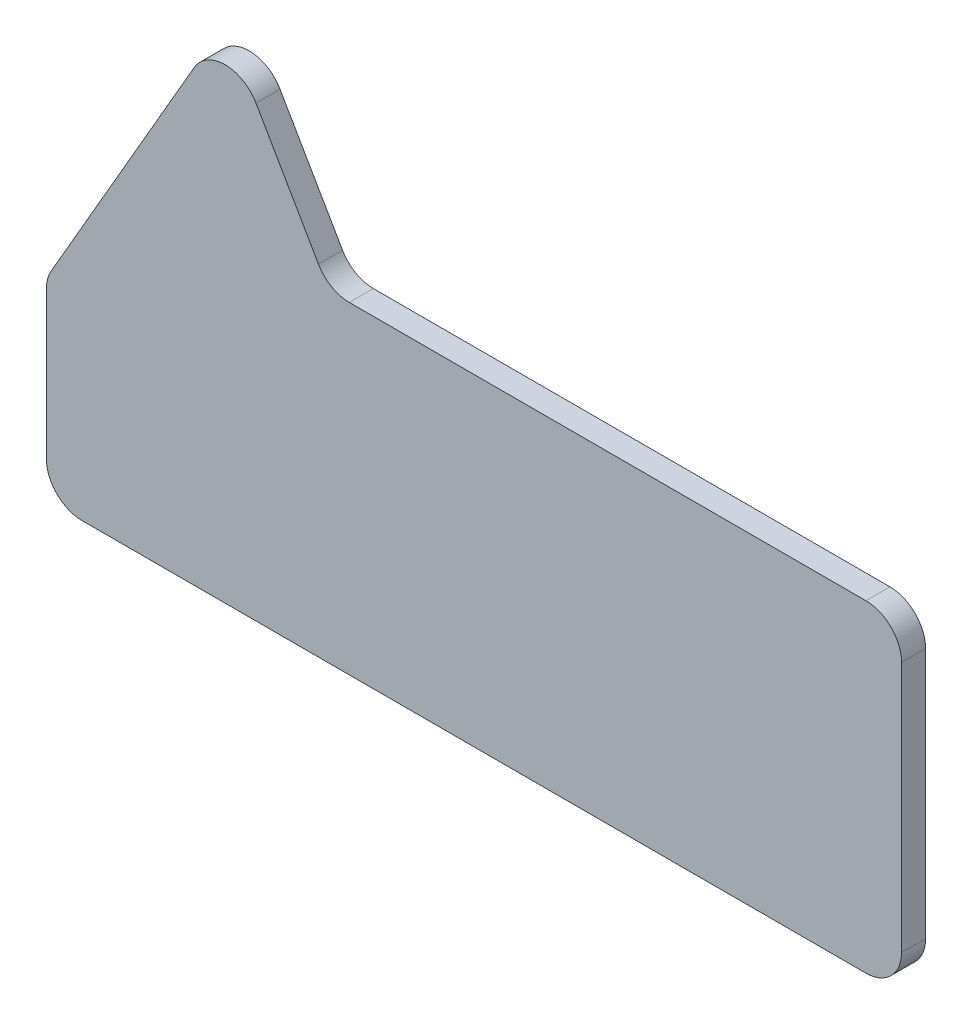
ISO-10303-21;
HEADER;
FILE_DESCRIPTION(('STEP AP214'),'2;1');
FILE_NAME('part.step','',(''),(''),'','','');
FILE_SCHEMA(('AUTOMOTIVE_DESIGN { 1 0 10303 214 1 1 1 1 }'));
ENDSEC;
DATA;
#1=APPLICATION_CONTEXT('core data for automotive mechanical design processes');
#2=APPLICATION_PROTOCOL_DEFINITION('international standard','automotive_design',2000,#1);
#3=PRODUCT_CONTEXT('',#1,'mechanical');
#4=PRODUCT('Part','Part','',(#3));
#5=PRODUCT_RELATED_PRODUCT_CATEGORY('part','',(#4));
#6=PRODUCT_DEFINITION_FORMATION('','',#4);
#7=PRODUCT_DEFINITION_CONTEXT('part definition',#1,'design');
#8=PRODUCT_DEFINITION('design','',#6,#7);
#9=PRODUCT_DEFINITION_SHAPE('','',#8);
#10=(LENGTH_UNIT() NAMED_UNIT(*) SI_UNIT(.MILLI.,.METRE.));
#11=(NAMED_UNIT(*) PLANE_ANGLE_UNIT() SI_UNIT($,.RADIAN.));
#12=(NAMED_UNIT(*) SI_UNIT($,.STERADIAN.) SOLID_ANGLE_UNIT());
#13=UNCERTAINTY_MEASURE_WITH_UNIT(LENGTH_MEASURE(1.E-05),#10,'distance_accuracy_value','');
#14=(GEOMETRIC_REPRESENTATION_CONTEXT(3) GLOBAL_UNCERTAINTY_ASSIGNED_CONTEXT((#13)) GLOBAL_UNIT_ASSIGNED_CONTEXT((#10,
#11,#12)) REPRESENTATION_CONTEXT('',''));
#15=CARTESIAN_POINT('',(0.,0.,0.));
#16=DIRECTION('',(0.,0.,1.));
#17=DIRECTION('',(1.,0.,0.));
#18=AXIS2_PLACEMENT_3D('',#15,#16,#17);
#19=CARTESIAN_POINT('',(23.4386772303298,-8.59629034495361,1.35));
#20=DIRECTION('',(0.,0.,-1.));
#21=DIRECTION('',(-1.,0.,0.));
#22=AXIS2_PLACEMENT_3D('',#19,#20,#21);
#23=CYLINDRICAL_SURFACE('',#22,2.);
#24=CARTESIAN_POINT('',(23.4386772303298,-8.59629034495361,0.));
#25=DIRECTION('',(0.,0.,1.));
#26=DIRECTION('',(1.,0.,0.));
#27=AXIS2_PLACEMENT_3D('',#24,#25,#26);
#28=CIRCLE('',#27,2.);
#29=CARTESIAN_POINT('',(23.4386772303298,-10.5962903449536,0.));
#30=VERTEX_POINT('',#29);
#31=CARTESIAN_POINT('',(25.4386772303298,-8.5962903449536,0.));
#32=VERTEX_POINT('',#31);
#33=EDGE_CURVE('E153',#30,#32,#28,.T.);
#34=ORIENTED_EDGE('',*,*,#33,.T.);
#35=DIRECTION('',(0.,0.,-1.));
#36=VECTOR('',#35,1.);
#37=CARTESIAN_POINT('',(25.4386772303298,-8.5962903449536,1.35));
#38=LINE('',#37,#36);
#39=CARTESIAN_POINT('',(25.4386772303298,-8.5962903449536,1.35));
#40=VERTEX_POINT('',#39);
#41=EDGE_CURVE('E11',#40,#32,#38,.T.);
#42=ORIENTED_EDGE('',*,*,#41,.F.);
#43=CARTESIAN_POINT('',(23.4386772303298,-8.59629034495361,1.35));
#44=DIRECTION('',(0.,0.,1.));
#45=DIRECTION('',(1.,0.,0.));
#46=AXIS2_PLACEMENT_3D('',#43,#44,#45);
#47=CIRCLE('',#46,2.);
#48=CARTESIAN_POINT('',(23.4386772303298,-10.5962903449536,1.35));
#49=VERTEX_POINT('',#48);
#50=EDGE_CURVE('E175',#49,#40,#47,.T.);
#51=ORIENTED_EDGE('',*,*,#50,.F.);
#52=DIRECTION('',(0.,0.,-1.));
#53=VECTOR('',#52,1.);
#54=CARTESIAN_POINT('',(23.4386772303298,-10.5962903449536,1.35));
#55=LINE('',#54,#53);
#56=EDGE_CURVE('E149',#49,#30,#55,.T.);
#57=ORIENTED_EDGE('',*,*,#56,.T.);
#58=EDGE_LOOP('',(#34,#42,#51,#57));
#59=FACE_BOUND('',#58,.T.);
#60=ADVANCED_FACE('F33',(#59),#23,.T.);
#61=CARTESIAN_POINT('',(25.4386772303298,5.50370965504639,1.35));
#62=DIRECTION('',(-1.,0.,0.));
#63=DIRECTION('',(0.,-1.,0.));
#64=AXIS2_PLACEMENT_3D('',#61,#62,#63);
#65=PLANE('',#64);
#66=DIRECTION('',(0.,1.,0.));
#67=VECTOR('',#66,1.);
#68=CARTESIAN_POINT('',(25.4386772303298,5.50370965504639,0.));
#69=LINE('',#68,#67);
#70=CARTESIAN_POINT('',(25.4386772303298,5.50370965504639,0.));
#71=VERTEX_POINT('',#70);
#72=EDGE_CURVE('E156',#32,#71,#69,.T.);
#73=ORIENTED_EDGE('',*,*,#72,.T.);
#74=DIRECTION('',(0.,0.,-1.));
#75=VECTOR('',#74,1.);
#76=CARTESIAN_POINT('',(25.4386772303298,5.50370965504639,1.35));
#77=LINE('',#76,#75);
#78=CARTESIAN_POINT('',(25.4386772303298,5.50370965504639,1.35));
#79=VERTEX_POINT('',#78);
#80=EDGE_CURVE('E41',#79,#71,#77,.T.);
#81=ORIENTED_EDGE('',*,*,#80,.F.);
#82=DIRECTION('',(0.,1.,0.));
#83=VECTOR('',#82,1.);
#84=CARTESIAN_POINT('',(25.4386772303298,5.50370965504639,1.35));
#85=LINE('',#84,#83);
#86=EDGE_CURVE('E104',#40,#79,#85,.T.);
#87=ORIENTED_EDGE('',*,*,#86,.F.);
#88=ORIENTED_EDGE('',*,*,#41,.T.);
#89=EDGE_LOOP('',(#73,#81,#87,#88));
#90=FACE_BOUND('',#89,.T.);
#91=ADVANCED_FACE('F253',(#90),#65,.F.);
#92=CARTESIAN_POINT('',(23.4386772303298,5.50370965504639,1.35));
#93=DIRECTION('',(0.,0.,-1.));
#94=DIRECTION('',(-1.,0.,0.));
#95=AXIS2_PLACEMENT_3D('',#92,#93,#94);
#96=CYLINDRICAL_SURFACE('',#95,2.);
#97=CARTESIAN_POINT('',(23.4386772303298,5.50370965504639,0.));
#98=DIRECTION('',(0.,0.,1.));
#99=DIRECTION('',(1.,0.,0.));
#100=AXIS2_PLACEMENT_3D('',#97,#98,#99);
#101=CIRCLE('',#100,2.);
#102=CARTESIAN_POINT('',(23.4386772303298,7.50370965504639,0.));
#103=VERTEX_POINT('',#102);
#104=EDGE_CURVE('E158',#71,#103,#101,.T.);
#105=ORIENTED_EDGE('',*,*,#104,.T.);
#106=DIRECTION('',(0.,0.,-1.));
#107=VECTOR('',#106,1.);
#108=CARTESIAN_POINT('',(23.4386772303298,7.50370965504639,1.35));
#109=LINE('',#108,#107);
#110=CARTESIAN_POINT('',(23.4386772303298,7.50370965504639,1.35));
#111=VERTEX_POINT('',#110);
#112=EDGE_CURVE('E194',#111,#103,#109,.T.);
#113=ORIENTED_EDGE('',*,*,#112,.F.);
#114=CARTESIAN_POINT('',(23.4386772303298,5.50370965504639,1.35));
#115=DIRECTION('',(0.,0.,1.));
#116=DIRECTION('',(1.,0.,0.));
#117=AXIS2_PLACEMENT_3D('',#114,#115,#116);
#118=CIRCLE('',#117,2.);
#119=EDGE_CURVE('E202',#79,#111,#118,.T.);
#120=ORIENTED_EDGE('',*,*,#119,.F.);
#121=ORIENTED_EDGE('',*,*,#80,.T.);
#122=EDGE_LOOP('',(#105,#113,#120,#121));
#123=FACE_BOUND('',#122,.T.);
#124=ADVANCED_FACE('F200',(#123),#96,.T.);
#125=CARTESIAN_POINT('',(23.4386772303298,7.50370965504639,1.35));
#126=DIRECTION('',(0.,-1.,0.));
#127=DIRECTION('',(1.,0.,0.));
#128=AXIS2_PLACEMENT_3D('',#125,#126,#127);
#129=PLANE('',#128);
#130=DIRECTION('',(-1.,0.,0.));
#131=VECTOR('',#130,1.);
#132=CARTESIAN_POINT('',(23.4386772303298,7.50370965504639,0.));
#133=LINE('',#132,#131);
#134=CARTESIAN_POINT('',(-5.55175383132779,7.50370965504646,0.));
#135=VERTEX_POINT('',#134);
#136=EDGE_CURVE('E160',#103,#135,#133,.T.);
#137=ORIENTED_EDGE('',*,*,#136,.T.);
#138=DIRECTION('',(0.,0.,-1.));
#139=VECTOR('',#138,1.);
#140=CARTESIAN_POINT('',(-5.55175383132779,7.50370965504646,1.35));
#141=LINE('',#140,#139);
#142=CARTESIAN_POINT('',(-5.55175383132779,7.50370965504646,1.35));
#143=VERTEX_POINT('',#142);
#144=EDGE_CURVE('E191',#143,#135,#141,.T.);
#145=ORIENTED_EDGE('',*,*,#144,.F.);
#146=DIRECTION('',(-1.,0.,0.));
#147=VECTOR('',#146,1.);
#148=CARTESIAN_POINT('',(23.4386772303298,7.50370965504639,1.35));
#149=LINE('',#148,#147);
#150=EDGE_CURVE('E220',#111,#143,#149,.T.);
#151=ORIENTED_EDGE('',*,*,#150,.F.);
#152=ORIENTED_EDGE('',*,*,#112,.T.);
#153=EDGE_LOOP('',(#137,#145,#151,#152));
#154=FACE_BOUND('',#153,.T.);
#155=ADVANCED_FACE('F211',(#154),#129,.F.);
#156=CARTESIAN_POINT('',(-5.55175383132775,9.50370965504634,1.35));
#157=DIRECTION('',(0.,0.,-1.));
#158=DIRECTION('',(-1.,0.,0.));
#159=AXIS2_PLACEMENT_3D('',#156,#157,#158);
#160=CYLINDRICAL_SURFACE('',#159,1.99999999999988);
#161=CARTESIAN_POINT('',(-5.55175383132775,9.50370965504634,0.));
#162=DIRECTION('',(0.,0.,-1.));
#163=DIRECTION('',(1.,0.,0.));
#164=AXIS2_PLACEMENT_3D('',#161,#162,#163);
#165=CIRCLE('',#164,1.99999999999988);
#166=CARTESIAN_POINT('',(-7.2838046388967,8.50370965504656,0.));
#167=VERTEX_POINT('',#166);
#168=EDGE_CURVE('E162',#135,#167,#165,.T.);
#169=ORIENTED_EDGE('',*,*,#168,.T.);
#170=DIRECTION('',(0.,0.,-1.));
#171=VECTOR('',#170,1.);
#172=CARTESIAN_POINT('',(-7.2838046388967,8.50370965504656,1.35));
#173=LINE('',#172,#171);
#174=CARTESIAN_POINT('',(-7.2838046388967,8.50370965504656,1.35));
#175=VERTEX_POINT('',#174);
#176=EDGE_CURVE('E188',#175,#167,#173,.T.);
#177=ORIENTED_EDGE('',*,*,#176,.F.);
#178=CARTESIAN_POINT('',(-5.55175383132775,9.50370965504634,1.35));
#179=DIRECTION('',(0.,0.,-1.));
#180=DIRECTION('',(1.,0.,0.));
#181=AXIS2_PLACEMENT_3D('',#178,#179,#180);
#182=CIRCLE('',#181,1.99999999999988);
#183=EDGE_CURVE('E217',#143,#175,#182,.T.);
#184=ORIENTED_EDGE('',*,*,#183,.F.);
#185=ORIENTED_EDGE('',*,*,#144,.T.);
#186=EDGE_LOOP('',(#169,#177,#184,#185));
#187=FACE_BOUND('',#186,.T.);
#188=ADVANCED_FACE('F215',(#187),#160,.F.);
#189=CARTESIAN_POINT('',(-7.2838046388967,8.50370965504656,1.35));
#190=DIRECTION('',(-0.866025403784422,-0.500000000000029,0.));
#191=DIRECTION('',(0.500000000000029,-0.866025403784422,0.));
#192=AXIS2_PLACEMENT_3D('',#189,#190,#191);
#193=PLANE('',#192);
#194=DIRECTION('',(-0.500000000000029,0.866025403784422,0.));
#195=VECTOR('',#194,1.);
#196=CARTESIAN_POINT('',(-7.2838046388967,8.50370965504656,0.));
#197=LINE('',#196,#195);
#198=CARTESIAN_POINT('',(-10.7879750940267,14.573110921713,0.));
#199=VERTEX_POINT('',#198);
#200=EDGE_CURVE('E164',#167,#199,#197,.T.);
#201=ORIENTED_EDGE('',*,*,#200,.T.);
#202=DIRECTION('',(0.,0.,-1.));
#203=VECTOR('',#202,1.);
#204=CARTESIAN_POINT('',(-10.7879750940267,14.573110921713,1.35));
#205=LINE('',#204,#203);
#206=CARTESIAN_POINT('',(-10.7879750940267,14.573110921713,1.35));
#207=VERTEX_POINT('',#206);
#208=EDGE_CURVE('E185',#207,#199,#205,.T.);
#209=ORIENTED_EDGE('',*,*,#208,.F.);
#210=DIRECTION('',(-0.500000000000029,0.866025403784422,0.));
#211=VECTOR('',#210,1.);
#212=CARTESIAN_POINT('',(-7.2838046388967,8.50370965504656,1.35));
#213=LINE('',#212,#211);
#214=EDGE_CURVE('E219',#175,#207,#213,.T.);
#215=ORIENTED_EDGE('',*,*,#214,.F.);
#216=ORIENTED_EDGE('',*,*,#176,.T.);
#217=EDGE_LOOP('',(#201,#209,#215,#216));
#218=FACE_BOUND('',#217,.T.);
#219=ADVANCED_FACE('F266',(#218),#193,.F.);
#220=CARTESIAN_POINT('',(-12.5200259015956,13.573110921713,1.35));
#221=DIRECTION('',(0.,0.,-1.));
#222=DIRECTION('',(-1.,0.,0.));
#223=AXIS2_PLACEMENT_3D('',#220,#221,#222);
#224=CYLINDRICAL_SURFACE('',#223,2.);
#225=CARTESIAN_POINT('',(-12.5200259015956,13.573110921713,0.));
#226=DIRECTION('',(0.,0.,1.));
#227=DIRECTION('',(-1.,0.,0.));
#228=AXIS2_PLACEMENT_3D('',#225,#226,#227);
#229=CIRCLE('',#228,2.);
#230=CARTESIAN_POINT('',(-14.2520767091645,14.573110921713,0.));
#231=VERTEX_POINT('',#230);
#232=EDGE_CURVE('E166',#199,#231,#229,.T.);
#233=ORIENTED_EDGE('',*,*,#232,.T.);
#234=DIRECTION('',(0.,0.,-1.));
#235=VECTOR('',#234,1.);
#236=CARTESIAN_POINT('',(-14.2520767091645,14.573110921713,1.35));
#237=LINE('',#236,#235);
#238=CARTESIAN_POINT('',(-14.2520767091645,14.573110921713,1.35));
#239=VERTEX_POINT('',#238);
#240=EDGE_CURVE('E182',#239,#231,#237,.T.);
#241=ORIENTED_EDGE('',*,*,#240,.F.);
#242=CARTESIAN_POINT('',(-12.5200259015956,13.573110921713,1.35));
#243=DIRECTION('',(0.,0.,1.));
#244=DIRECTION('',(-1.,0.,0.));
#245=AXIS2_PLACEMENT_3D('',#242,#243,#244);
#246=CIRCLE('',#245,2.);
#247=EDGE_CURVE('E222',#207,#239,#246,.T.);
#248=ORIENTED_EDGE('',*,*,#247,.F.);
#249=ORIENTED_EDGE('',*,*,#208,.T.);
#250=EDGE_LOOP('',(#233,#241,#248,#249));
#251=FACE_BOUND('',#250,.T.);
#252=ADVANCED_FACE('F269',(#251),#224,.T.);
#253=CARTESIAN_POINT('',(-14.2520767091645,14.573110921713,1.35));
#254=DIRECTION('',(0.866025403784441,-0.499999999999995,0.));
#255=DIRECTION('',(0.499999999999995,0.866025403784442,0.));
#256=AXIS2_PLACEMENT_3D('',#253,#254,#255);
#257=PLANE('',#256);
#258=DIRECTION('',(-0.499999999999995,-0.866025403784441,0.));
#259=VECTOR('',#258,1.);
#260=CARTESIAN_POINT('',(-14.2520767091645,14.573110921713,0.));
#261=LINE('',#260,#259);
#262=CARTESIAN_POINT('',(-22.2822037280863,0.664522933708779,0.));
#263=VERTEX_POINT('',#262);
#264=EDGE_CURVE('E168',#231,#263,#261,.T.);
#265=ORIENTED_EDGE('',*,*,#264,.T.);
#266=DIRECTION('',(0.,0.,-1.));
#267=VECTOR('',#266,1.);
#268=CARTESIAN_POINT('',(-22.2822037280863,0.664522933708779,1.35));
#269=LINE('',#268,#267);
#270=CARTESIAN_POINT('',(-22.2822037280863,0.664522933708779,1.35));
#271=VERTEX_POINT('',#270);
#272=EDGE_CURVE('E179',#271,#263,#269,.T.);
#273=ORIENTED_EDGE('',*,*,#272,.F.);
#274=DIRECTION('',(-0.499999999999995,-0.866025403784441,0.));
#275=VECTOR('',#274,1.);
#276=CARTESIAN_POINT('',(-14.2520767091645,14.573110921713,1.35));
#277=LINE('',#276,#275);
#278=EDGE_CURVE('E228',#239,#271,#277,.T.);
#279=ORIENTED_EDGE('',*,*,#278,.F.);
#280=ORIENTED_EDGE('',*,*,#240,.T.);
#281=EDGE_LOOP('',(#265,#273,#279,#280));
#282=FACE_BOUND('',#281,.T.);
#283=ADVANCED_FACE('F234',(#282),#257,.F.);
#284=CARTESIAN_POINT('',(-20.5501529205184,-0.335477066290429,1.35));
#285=DIRECTION('',(0.,0.,-1.));
#286=DIRECTION('',(-1.,0.,0.));
#287=AXIS2_PLACEMENT_3D('',#284,#285,#286);
#288=CYLINDRICAL_SURFACE('',#287,1.99999999999877);
#289=CARTESIAN_POINT('',(-20.5501529205184,-0.335477066290429,0.));
#290=DIRECTION('',(0.,0.,1.));
#291=DIRECTION('',(1.,0.,0.));
#292=AXIS2_PLACEMENT_3D('',#289,#290,#291);
#293=CIRCLE('',#292,1.99999999999877);
#294=CARTESIAN_POINT('',(-22.5501529205172,-0.335477066290765,0.));
#295=VERTEX_POINT('',#294);
#296=EDGE_CURVE('E170',#263,#295,#293,.T.);
#297=ORIENTED_EDGE('',*,*,#296,.T.);
#298=DIRECTION('',(0.,0.,-1.));
#299=VECTOR('',#298,1.);
#300=CARTESIAN_POINT('',(-22.5501529205172,-0.335477066290765,1.35));
#301=LINE('',#300,#299);
#302=CARTESIAN_POINT('',(-22.5501529205172,-0.335477066290765,1.35));
#303=VERTEX_POINT('',#302);
#304=EDGE_CURVE('E144',#303,#295,#301,.T.);
#305=ORIENTED_EDGE('',*,*,#304,.F.);
#306=CARTESIAN_POINT('',(-20.5501529205184,-0.335477066290429,1.35));
#307=DIRECTION('',(0.,0.,1.));
#308=DIRECTION('',(1.,0.,0.));
#309=AXIS2_PLACEMENT_3D('',#306,#307,#308);
#310=CIRCLE('',#309,1.99999999999877);
#311=EDGE_CURVE('E135',#271,#303,#310,.T.);
#312=ORIENTED_EDGE('',*,*,#311,.F.);
#313=ORIENTED_EDGE('',*,*,#272,.T.);
#314=EDGE_LOOP('',(#297,#305,#312,#313));
#315=FACE_BOUND('',#314,.T.);
#316=ADVANCED_FACE('F238',(#315),#288,.T.);
#317=CARTESIAN_POINT('',(-22.5501529205174,-8.59629034495361,1.35));
#318=DIRECTION('',(1.,0.,0.));
#319=DIRECTION('',(0.,1.,0.));
#320=AXIS2_PLACEMENT_3D('',#317,#318,#319);
#321=PLANE('',#320);
#322=DIRECTION('',(0.,-1.,0.));
#323=VECTOR('',#322,1.);
#324=CARTESIAN_POINT('',(-22.5501529205174,-8.59629034495361,0.));
#325=LINE('',#324,#323);
#326=CARTESIAN_POINT('',(-22.5501529205174,-8.59629034495361,0.));
#327=VERTEX_POINT('',#326);
#328=EDGE_CURVE('E143',#295,#327,#325,.T.);
#329=ORIENTED_EDGE('',*,*,#328,.T.);
#330=DIRECTION('',(0.,0.,-1.));
#331=VECTOR('',#330,1.);
#332=CARTESIAN_POINT('',(-22.5501529205174,-8.59629034495361,1.35));
#333=LINE('',#332,#331);
#334=CARTESIAN_POINT('',(-22.5501529205174,-8.59629034495361,1.35));
#335=VERTEX_POINT('',#334);
#336=EDGE_CURVE('E140',#335,#327,#333,.T.);
#337=ORIENTED_EDGE('',*,*,#336,.F.);
#338=DIRECTION('',(0.,-1.,0.));
#339=VECTOR('',#338,1.);
#340=CARTESIAN_POINT('',(-22.5501529205174,-8.59629034495361,1.35));
#341=LINE('',#340,#339);
#342=EDGE_CURVE('E129',#303,#335,#341,.T.);
#343=ORIENTED_EDGE('',*,*,#342,.F.);
#344=ORIENTED_EDGE('',*,*,#304,.T.);
#345=EDGE_LOOP('',(#329,#337,#343,#344));
#346=FACE_BOUND('',#345,.T.);
#347=ADVANCED_FACE('F141',(#346),#321,.F.);
#348=CARTESIAN_POINT('',(-20.5501529205174,-8.59629034495361,1.35));
#349=DIRECTION('',(0.,0.,-1.));
#350=DIRECTION('',(-1.,0.,0.));
#351=AXIS2_PLACEMENT_3D('',#348,#349,#350);
#352=CYLINDRICAL_SURFACE('',#351,2.);
#353=CARTESIAN_POINT('',(-20.5501529205174,-8.59629034495361,0.));
#354=DIRECTION('',(0.,0.,1.));
#355=DIRECTION('',(-1.,0.,0.));
#356=AXIS2_PLACEMENT_3D('',#353,#354,#355);
#357=CIRCLE('',#356,2.);
#358=CARTESIAN_POINT('',(-20.5501529205174,-10.5962903449536,0.));
#359=VERTEX_POINT('',#358);
#360=EDGE_CURVE('E90',#327,#359,#357,.T.);
#361=ORIENTED_EDGE('',*,*,#360,.T.);
#362=DIRECTION('',(0.,0.,-1.));
#363=VECTOR('',#362,1.);
#364=CARTESIAN_POINT('',(-20.5501529205174,-10.5962903449536,1.35));
#365=LINE('',#364,#363);
#366=CARTESIAN_POINT('',(-20.5501529205174,-10.5962903449536,1.35));
#367=VERTEX_POINT('',#366);
#368=EDGE_CURVE('E145',#367,#359,#365,.T.);
#369=ORIENTED_EDGE('',*,*,#368,.F.);
#370=CARTESIAN_POINT('',(-20.5501529205174,-8.59629034495361,1.35));
#371=DIRECTION('',(0.,0.,1.));
#372=DIRECTION('',(-1.,0.,0.));
#373=AXIS2_PLACEMENT_3D('',#370,#371,#372);
#374=CIRCLE('',#373,2.);
#375=EDGE_CURVE('E133',#335,#367,#374,.T.);
#376=ORIENTED_EDGE('',*,*,#375,.F.);
#377=ORIENTED_EDGE('',*,*,#336,.T.);
#378=EDGE_LOOP('',(#361,#369,#376,#377));
#379=FACE_BOUND('',#378,.T.);
#380=ADVANCED_FACE('F147',(#379),#352,.T.);
#381=CARTESIAN_POINT('',(-20.5501529205174,-10.5962903449536,1.35));
#382=DIRECTION('',(0.,1.,0.));
#383=DIRECTION('',(-1.,0.,0.));
#384=AXIS2_PLACEMENT_3D('',#381,#382,#383);
#385=PLANE('',#384);
#386=DIRECTION('',(1.,0.,0.));
#387=VECTOR('',#386,1.);
#388=CARTESIAN_POINT('',(-20.5501529205174,-10.5962903449536,0.));
#389=LINE('',#388,#387);
#390=EDGE_CURVE('E96',#359,#30,#389,.T.);
#391=ORIENTED_EDGE('',*,*,#390,.T.);
#392=ORIENTED_EDGE('',*,*,#56,.F.);
#393=DIRECTION('',(1.,0.,0.));
#394=VECTOR('',#393,1.);
#395=CARTESIAN_POINT('',(-20.5501529205174,-10.5962903449536,1.35));
#396=LINE('',#395,#394);
#397=EDGE_CURVE('E49',#367,#49,#396,.T.);
#398=ORIENTED_EDGE('',*,*,#397,.F.);
#399=ORIENTED_EDGE('',*,*,#368,.T.);
#400=EDGE_LOOP('',(#391,#392,#398,#399));
#401=FACE_BOUND('',#400,.T.);
#402=ADVANCED_FACE('F242',(#401),#385,.F.);
#403=CARTESIAN_POINT('',(23.4386772303298,-8.59629034495361,1.35));
#404=DIRECTION('',(0.,0.,1.));
#405=DIRECTION('',(1.,0.,0.));
#406=AXIS2_PLACEMENT_3D('',#403,#404,#405);
#407=PLANE('',#406);
#408=ORIENTED_EDGE('',*,*,#50,.T.);
#409=ORIENTED_EDGE('',*,*,#86,.T.);
#410=ORIENTED_EDGE('',*,*,#119,.T.);
#411=ORIENTED_EDGE('',*,*,#150,.T.);
#412=ORIENTED_EDGE('',*,*,#183,.T.);
#413=ORIENTED_EDGE('',*,*,#214,.T.);
#414=ORIENTED_EDGE('',*,*,#247,.T.);
#415=ORIENTED_EDGE('',*,*,#278,.T.);
#416=ORIENTED_EDGE('',*,*,#311,.T.);
#417=ORIENTED_EDGE('',*,*,#342,.T.);
#418=ORIENTED_EDGE('',*,*,#375,.T.);
#419=ORIENTED_EDGE('',*,*,#397,.T.);
#420=EDGE_LOOP('',(#408,#409,#410,#411,#412,#413,#414,#415,#416,#417,#418,#419));
#421=FACE_BOUND('',#420,.T.);
#422=ADVANCED_FACE('F131',(#421),#407,.T.);
#423=CARTESIAN_POINT('',(23.4386772303298,-8.59629034495361,0.));
#424=DIRECTION('',(0.,0.,1.));
#425=DIRECTION('',(1.,0.,0.));
#426=AXIS2_PLACEMENT_3D('',#423,#424,#425);
#427=PLANE('',#426);
#428=ORIENTED_EDGE('',*,*,#33,.F.);
#429=ORIENTED_EDGE('',*,*,#390,.F.);
#430=ORIENTED_EDGE('',*,*,#360,.F.);
#431=ORIENTED_EDGE('',*,*,#328,.F.);
#432=ORIENTED_EDGE('',*,*,#296,.F.);
#433=ORIENTED_EDGE('',*,*,#264,.F.);
#434=ORIENTED_EDGE('',*,*,#232,.F.);
#435=ORIENTED_EDGE('',*,*,#200,.F.);
#436=ORIENTED_EDGE('',*,*,#168,.F.);
#437=ORIENTED_EDGE('',*,*,#136,.F.);
#438=ORIENTED_EDGE('',*,*,#104,.F.);
#439=ORIENTED_EDGE('',*,*,#72,.F.);
#440=EDGE_LOOP('',(#428,#429,#430,#431,#432,#433,#434,#435,#436,#437,#438,#439));
#441=FACE_BOUND('',#440,.T.);
#442=ADVANCED_FACE('F206',(#441),#427,.F.);
#443=CLOSED_SHELL('',(#60,#91,#124,#155,#188,#219,#252,#283,#316,#347,#380,#402,#422,#442));
#444=MANIFOLD_SOLID_BREP('B2',#443);
#445=ADVANCED_BREP_SHAPE_REPRESENTATION('',(#18,#444),#14);
#446=SHAPE_DEFINITION_REPRESENTATION(#9,#445);
ENDSEC;
END-ISO-10303-21;
